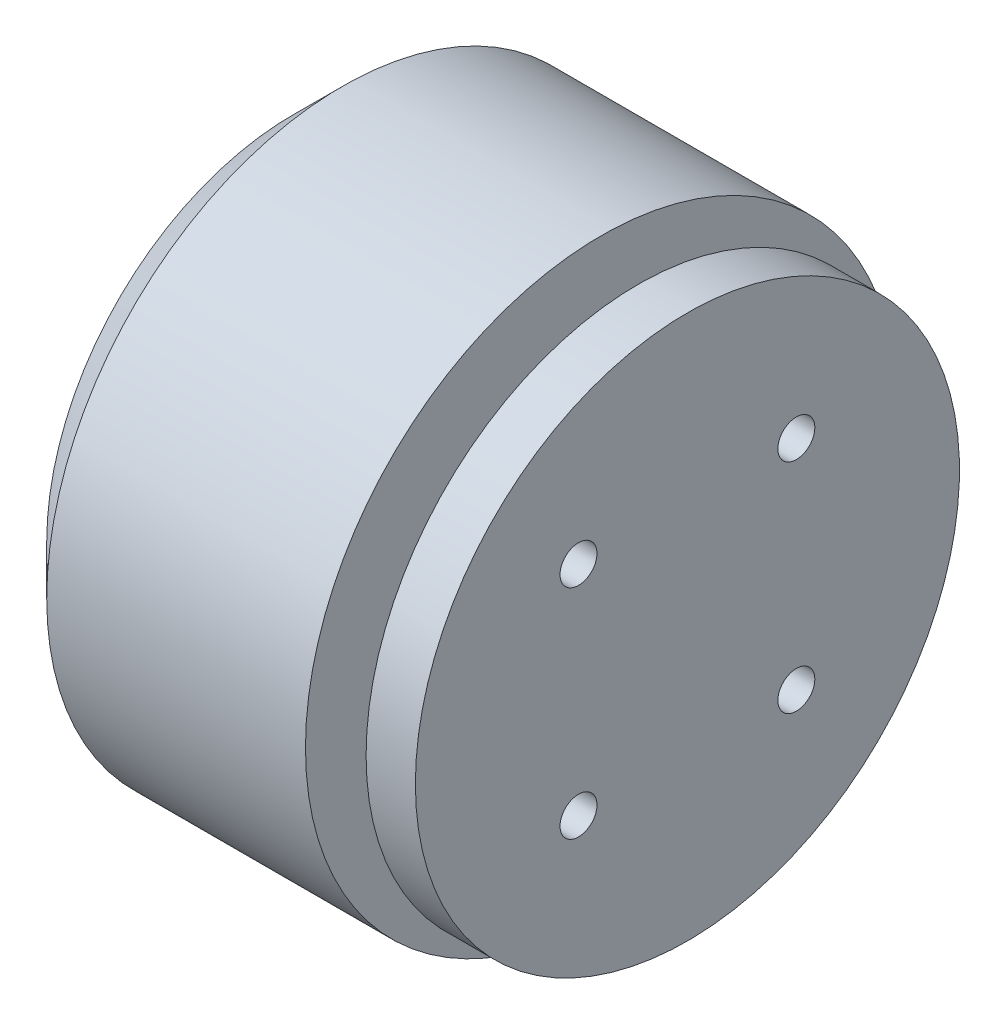
ISO-10303-21;
HEADER;
FILE_DESCRIPTION(('STEP AP214'),'2;1');
FILE_NAME('part.step','',(''),(''),'','','');
FILE_SCHEMA(('AUTOMOTIVE_DESIGN { 1 0 10303 214 1 1 1 1 }'));
ENDSEC;
DATA;
#1=APPLICATION_CONTEXT('core data for automotive mechanical design processes');
#2=APPLICATION_PROTOCOL_DEFINITION('international standard','automotive_design',2000,#1);
#3=PRODUCT_CONTEXT('',#1,'mechanical');
#4=PRODUCT('Part','Part','',(#3));
#5=PRODUCT_RELATED_PRODUCT_CATEGORY('part','',(#4));
#6=PRODUCT_DEFINITION_FORMATION('','',#4);
#7=PRODUCT_DEFINITION_CONTEXT('part definition',#1,'design');
#8=PRODUCT_DEFINITION('design','',#6,#7);
#9=PRODUCT_DEFINITION_SHAPE('','',#8);
#10=(LENGTH_UNIT() NAMED_UNIT(*) SI_UNIT(.MILLI.,.METRE.));
#11=(NAMED_UNIT(*) PLANE_ANGLE_UNIT() SI_UNIT($,.RADIAN.));
#12=(NAMED_UNIT(*) SI_UNIT($,.STERADIAN.) SOLID_ANGLE_UNIT());
#13=UNCERTAINTY_MEASURE_WITH_UNIT(LENGTH_MEASURE(1.E-05),#10,'distance_accuracy_value','');
#14=(GEOMETRIC_REPRESENTATION_CONTEXT(3) GLOBAL_UNCERTAINTY_ASSIGNED_CONTEXT((#13)) GLOBAL_UNIT_ASSIGNED_CONTEXT((#10,
#11,#12)) REPRESENTATION_CONTEXT('',''));
#15=CARTESIAN_POINT('',(0.,0.,0.));
#16=DIRECTION('',(0.,0.,1.));
#17=DIRECTION('',(1.,0.,0.));
#18=AXIS2_PLACEMENT_3D('',#15,#16,#17);
#19=CARTESIAN_POINT('',(0.,0.,0.));
#20=DIRECTION('',(-1.,0.,0.));
#21=DIRECTION('',(0.,0.,1.));
#22=AXIS2_PLACEMENT_3D('',#19,#20,#21);
#23=PLANE('',#22);
#24=CARTESIAN_POINT('',(0.,-8.84,8.84));
#25=DIRECTION('',(1.,0.,0.));
#26=DIRECTION('',(0.,0.,-1.));
#27=AXIS2_PLACEMENT_3D('',#24,#25,#26);
#28=CIRCLE('',#27,1.5);
#29=CARTESIAN_POINT('',(0.,-8.84,7.34));
#30=VERTEX_POINT('',#29);
#31=EDGE_CURVE('E75',#30,#30,#28,.T.);
#32=ORIENTED_EDGE('',*,*,#31,.F.);
#33=EDGE_LOOP('',(#32));
#34=FACE_BOUND('',#33,.T.);
#35=CARTESIAN_POINT('',(0.,8.84,-8.84));
#36=DIRECTION('',(1.,0.,0.));
#37=DIRECTION('',(0.,0.,-1.));
#38=AXIS2_PLACEMENT_3D('',#35,#36,#37);
#39=CIRCLE('',#38,1.5);
#40=CARTESIAN_POINT('',(0.,8.84,-10.34));
#41=VERTEX_POINT('',#40);
#42=EDGE_CURVE('E81',#41,#41,#39,.T.);
#43=ORIENTED_EDGE('',*,*,#42,.F.);
#44=EDGE_LOOP('',(#43));
#45=FACE_BOUND('',#44,.T.);
#46=CARTESIAN_POINT('',(0.,-8.84,-8.84));
#47=DIRECTION('',(1.,0.,0.));
#48=DIRECTION('',(0.,0.,-1.));
#49=AXIS2_PLACEMENT_3D('',#46,#47,#48);
#50=CIRCLE('',#49,1.5);
#51=CARTESIAN_POINT('',(0.,-8.84,-10.34));
#52=VERTEX_POINT('',#51);
#53=EDGE_CURVE('E82',#52,#52,#50,.T.);
#54=ORIENTED_EDGE('',*,*,#53,.F.);
#55=EDGE_LOOP('',(#54));
#56=FACE_BOUND('',#55,.T.);
#57=CARTESIAN_POINT('',(0.,8.84,8.84));
#58=DIRECTION('',(1.,0.,0.));
#59=DIRECTION('',(0.,0.,-1.));
#60=AXIS2_PLACEMENT_3D('',#57,#58,#59);
#61=CIRCLE('',#60,1.5);
#62=CARTESIAN_POINT('',(0.,8.84,7.34));
#63=VERTEX_POINT('',#62);
#64=EDGE_CURVE('E72',#63,#63,#61,.T.);
#65=ORIENTED_EDGE('',*,*,#64,.F.);
#66=EDGE_LOOP('',(#65));
#67=FACE_BOUND('',#66,.T.);
#68=CARTESIAN_POINT('',(0.,0.,0.));
#69=DIRECTION('',(-1.,0.,0.));
#70=DIRECTION('',(0.,0.,1.));
#71=AXIS2_PLACEMENT_3D('',#68,#69,#70);
#72=CIRCLE('',#71,22.08);
#73=CARTESIAN_POINT('',(0.,0.,22.08));
#74=VERTEX_POINT('',#73);
#75=EDGE_CURVE('E10',#74,#74,#72,.T.);
#76=ORIENTED_EDGE('',*,*,#75,.F.);
#77=EDGE_LOOP('',(#76));
#78=FACE_BOUND('',#77,.T.);
#79=ADVANCED_FACE('F37',(#34,#45,#56,#67,#78),#23,.F.);
#80=CARTESIAN_POINT('',(-10.,0.,0.));
#81=DIRECTION('',(-1.,0.,0.));
#82=DIRECTION('',(0.,0.,1.));
#83=AXIS2_PLACEMENT_3D('',#80,#81,#82);
#84=CYLINDRICAL_SURFACE('',#83,22.08);
#85=CARTESIAN_POINT('',(-4.,0.,0.));
#86=DIRECTION('',(-1.,0.,0.));
#87=DIRECTION('',(0.,0.,1.));
#88=AXIS2_PLACEMENT_3D('',#85,#86,#87);
#89=CIRCLE('',#88,22.08);
#90=CARTESIAN_POINT('',(-4.,0.,22.08));
#91=VERTEX_POINT('',#90);
#92=EDGE_CURVE('E43',#91,#91,#89,.T.);
#93=ORIENTED_EDGE('',*,*,#92,.F.);
#94=EDGE_LOOP('',(#93));
#95=FACE_BOUND('',#94,.T.);
#96=ORIENTED_EDGE('',*,*,#75,.T.);
#97=EDGE_LOOP('',(#96));
#98=FACE_BOUND('',#97,.T.);
#99=ADVANCED_FACE('F132',(#95,#98),#84,.T.);
#100=CARTESIAN_POINT('',(-4.,22.08,0.));
#101=DIRECTION('',(1.,0.,0.));
#102=DIRECTION('',(0.,0.,-1.));
#103=AXIS2_PLACEMENT_3D('',#100,#101,#102);
#104=PLANE('',#103);
#105=CARTESIAN_POINT('',(-4.,0.,0.));
#106=DIRECTION('',(-1.,0.,0.));
#107=DIRECTION('',(0.,0.,1.));
#108=AXIS2_PLACEMENT_3D('',#105,#106,#107);
#109=CIRCLE('',#108,16.8);
#110=CARTESIAN_POINT('',(-4.,0.,16.8));
#111=VERTEX_POINT('',#110);
#112=EDGE_CURVE('E47',#111,#111,#109,.T.);
#113=ORIENTED_EDGE('',*,*,#112,.F.);
#114=EDGE_LOOP('',(#113));
#115=FACE_BOUND('',#114,.T.);
#116=ORIENTED_EDGE('',*,*,#92,.T.);
#117=EDGE_LOOP('',(#116));
#118=FACE_BOUND('',#117,.T.);
#119=ADVANCED_FACE('F139',(#115,#118),#104,.F.);
#120=CARTESIAN_POINT('',(-10.,0.,0.));
#121=DIRECTION('',(-1.,0.,0.));
#122=DIRECTION('',(0.,0.,1.));
#123=AXIS2_PLACEMENT_3D('',#120,#121,#122);
#124=CYLINDRICAL_SURFACE('',#123,16.8);
#125=CARTESIAN_POINT('',(-7.,0.,0.));
#126=DIRECTION('',(-1.,0.,0.));
#127=DIRECTION('',(0.,0.,1.));
#128=AXIS2_PLACEMENT_3D('',#125,#126,#127);
#129=CIRCLE('',#128,16.8);
#130=CARTESIAN_POINT('',(-7.,0.,16.8));
#131=VERTEX_POINT('',#130);
#132=EDGE_CURVE('E51',#131,#131,#129,.T.);
#133=ORIENTED_EDGE('',*,*,#132,.F.);
#134=EDGE_LOOP('',(#133));
#135=FACE_BOUND('',#134,.T.);
#136=ORIENTED_EDGE('',*,*,#112,.T.);
#137=EDGE_LOOP('',(#136));
#138=FACE_BOUND('',#137,.T.);
#139=ADVANCED_FACE('F185',(#135,#138),#124,.T.);
#140=CARTESIAN_POINT('',(-7.,16.8,0.));
#141=DIRECTION('',(-1.,0.,0.));
#142=DIRECTION('',(0.,0.,1.));
#143=AXIS2_PLACEMENT_3D('',#140,#141,#142);
#144=PLANE('',#143);
#145=CARTESIAN_POINT('',(-7.,0.,0.));
#146=DIRECTION('',(-1.,0.,0.));
#147=DIRECTION('',(0.,0.,1.));
#148=AXIS2_PLACEMENT_3D('',#145,#146,#147);
#149=CIRCLE('',#148,24.);
#150=CARTESIAN_POINT('',(-7.,0.,24.));
#151=VERTEX_POINT('',#150);
#152=EDGE_CURVE('E56',#151,#151,#149,.T.);
#153=ORIENTED_EDGE('',*,*,#152,.F.);
#154=EDGE_LOOP('',(#153));
#155=FACE_BOUND('',#154,.T.);
#156=ORIENTED_EDGE('',*,*,#132,.T.);
#157=EDGE_LOOP('',(#156));
#158=FACE_BOUND('',#157,.T.);
#159=ADVANCED_FACE('F181',(#155,#158),#144,.F.);
#160=CARTESIAN_POINT('',(-10.,0.,0.));
#161=DIRECTION('',(-1.,0.,0.));
#162=DIRECTION('',(0.,0.,1.));
#163=AXIS2_PLACEMENT_3D('',#160,#161,#162);
#164=CYLINDRICAL_SURFACE('',#163,24.);
#165=CARTESIAN_POINT('',(-28.,0.,0.));
#166=DIRECTION('',(-1.,0.,0.));
#167=DIRECTION('',(0.,0.,1.));
#168=AXIS2_PLACEMENT_3D('',#165,#166,#167);
#169=CIRCLE('',#168,24.);
#170=CARTESIAN_POINT('',(-28.,0.,24.));
#171=VERTEX_POINT('',#170);
#172=EDGE_CURVE('E59',#171,#171,#169,.T.);
#173=ORIENTED_EDGE('',*,*,#172,.F.);
#174=EDGE_LOOP('',(#173));
#175=FACE_BOUND('',#174,.T.);
#176=ORIENTED_EDGE('',*,*,#152,.T.);
#177=EDGE_LOOP('',(#176));
#178=FACE_BOUND('',#177,.T.);
#179=ADVANCED_FACE('F177',(#175,#178),#164,.T.);
#180=CARTESIAN_POINT('',(-28.,0.,0.));
#181=DIRECTION('',(1.,0.,0.));
#182=DIRECTION('',(0.,0.,-1.));
#183=AXIS2_PLACEMENT_3D('',#180,#181,#182);
#184=CONICAL_SURFACE('',#183,24.,0.785398163397449);
#185=CARTESIAN_POINT('',(-32.,0.,0.));
#186=DIRECTION('',(-1.,0.,0.));
#187=DIRECTION('',(0.,0.,1.));
#188=AXIS2_PLACEMENT_3D('',#185,#186,#187);
#189=CIRCLE('',#188,20.);
#190=CARTESIAN_POINT('',(-32.,0.,20.));
#191=VERTEX_POINT('',#190);
#192=EDGE_CURVE('E62',#191,#191,#189,.T.);
#193=ORIENTED_EDGE('',*,*,#192,.F.);
#194=EDGE_LOOP('',(#193));
#195=FACE_BOUND('',#194,.T.);
#196=ORIENTED_EDGE('',*,*,#172,.T.);
#197=EDGE_LOOP('',(#196));
#198=FACE_BOUND('',#197,.T.);
#199=ADVANCED_FACE('F173',(#195,#198),#184,.T.);
#200=CARTESIAN_POINT('',(-32.,20.,0.));
#201=DIRECTION('',(1.,0.,0.));
#202=DIRECTION('',(0.,0.,-1.));
#203=AXIS2_PLACEMENT_3D('',#200,#201,#202);
#204=PLANE('',#203);
#205=CARTESIAN_POINT('',(-32.,0.,6.));
#206=DIRECTION('',(1.,0.,0.));
#207=DIRECTION('',(0.,0.,-1.));
#208=AXIS2_PLACEMENT_3D('',#205,#206,#207);
#209=CIRCLE('',#208,1.5);
#210=CARTESIAN_POINT('',(-32.,0.,4.5));
#211=VERTEX_POINT('',#210);
#212=EDGE_CURVE('E114',#211,#211,#209,.T.);
#213=ORIENTED_EDGE('',*,*,#212,.T.);
#214=EDGE_LOOP('',(#213));
#215=FACE_BOUND('',#214,.T.);
#216=CARTESIAN_POINT('',(-32.,0.,-6.));
#217=DIRECTION('',(1.,0.,0.));
#218=DIRECTION('',(0.,0.,-1.));
#219=AXIS2_PLACEMENT_3D('',#216,#217,#218);
#220=CIRCLE('',#219,1.5);
#221=CARTESIAN_POINT('',(-32.,0.,-7.5));
#222=VERTEX_POINT('',#221);
#223=EDGE_CURVE('E111',#222,#222,#220,.T.);
#224=ORIENTED_EDGE('',*,*,#223,.T.);
#225=EDGE_LOOP('',(#224));
#226=FACE_BOUND('',#225,.T.);
#227=CARTESIAN_POINT('',(-32.,6.,0.));
#228=DIRECTION('',(1.,0.,0.));
#229=DIRECTION('',(0.,0.,-1.));
#230=AXIS2_PLACEMENT_3D('',#227,#228,#229);
#231=CIRCLE('',#230,1.5);
#232=CARTESIAN_POINT('',(-32.,6.,-1.5));
#233=VERTEX_POINT('',#232);
#234=EDGE_CURVE('E105',#233,#233,#231,.T.);
#235=ORIENTED_EDGE('',*,*,#234,.T.);
#236=EDGE_LOOP('',(#235));
#237=FACE_BOUND('',#236,.T.);
#238=CARTESIAN_POINT('',(-32.,-6.,0.));
#239=DIRECTION('',(1.,0.,0.));
#240=DIRECTION('',(0.,0.,-1.));
#241=AXIS2_PLACEMENT_3D('',#238,#239,#240);
#242=CIRCLE('',#241,1.5);
#243=CARTESIAN_POINT('',(-32.,-6.,-1.5));
#244=VERTEX_POINT('',#243);
#245=EDGE_CURVE('E99',#244,#244,#242,.T.);
#246=ORIENTED_EDGE('',*,*,#245,.T.);
#247=EDGE_LOOP('',(#246));
#248=FACE_BOUND('',#247,.T.);
#249=CARTESIAN_POINT('',(-32.,0.,0.));
#250=DIRECTION('',(-1.,0.,0.));
#251=DIRECTION('',(0.,0.,1.));
#252=AXIS2_PLACEMENT_3D('',#249,#250,#251);
#253=CIRCLE('',#252,2.);
#254=CARTESIAN_POINT('',(-32.,0.,2.));
#255=VERTEX_POINT('',#254);
#256=EDGE_CURVE('E65',#255,#255,#253,.T.);
#257=ORIENTED_EDGE('',*,*,#256,.F.);
#258=EDGE_LOOP('',(#257));
#259=FACE_BOUND('',#258,.T.);
#260=ORIENTED_EDGE('',*,*,#192,.T.);
#261=EDGE_LOOP('',(#260));
#262=FACE_BOUND('',#261,.T.);
#263=ADVANCED_FACE('F169',(#215,#226,#237,#248,#259,#262),#204,.F.);
#264=CARTESIAN_POINT('',(-10.,0.,0.));
#265=DIRECTION('',(-1.,0.,0.));
#266=DIRECTION('',(0.,0.,1.));
#267=AXIS2_PLACEMENT_3D('',#264,#265,#266);
#268=CYLINDRICAL_SURFACE('',#267,2.);
#269=CARTESIAN_POINT('',(-44.,0.,0.));
#270=DIRECTION('',(-1.,0.,0.));
#271=DIRECTION('',(0.,0.,1.));
#272=AXIS2_PLACEMENT_3D('',#269,#270,#271);
#273=CIRCLE('',#272,2.);
#274=CARTESIAN_POINT('',(-44.,0.,2.));
#275=VERTEX_POINT('',#274);
#276=EDGE_CURVE('E68',#275,#275,#273,.T.);
#277=ORIENTED_EDGE('',*,*,#276,.F.);
#278=EDGE_LOOP('',(#277));
#279=FACE_BOUND('',#278,.T.);
#280=ORIENTED_EDGE('',*,*,#256,.T.);
#281=EDGE_LOOP('',(#280));
#282=FACE_BOUND('',#281,.T.);
#283=ADVANCED_FACE('F161',(#279,#282),#268,.T.);
#284=CARTESIAN_POINT('',(-44.,2.,0.));
#285=DIRECTION('',(1.,0.,0.));
#286=DIRECTION('',(0.,0.,-1.));
#287=AXIS2_PLACEMENT_3D('',#284,#285,#286);
#288=PLANE('',#287);
#289=ORIENTED_EDGE('',*,*,#276,.T.);
#290=EDGE_LOOP('',(#289));
#291=FACE_BOUND('',#290,.T.);
#292=ADVANCED_FACE('F152',(#291),#288,.F.);
#293=CARTESIAN_POINT('',(-3.3,8.84,8.84));
#294=DIRECTION('',(1.,0.,0.));
#295=DIRECTION('',(0.,0.,-1.));
#296=AXIS2_PLACEMENT_3D('',#293,#294,#295);
#297=CYLINDRICAL_SURFACE('',#296,1.5);
#298=CARTESIAN_POINT('',(-3.3,8.84,8.84));
#299=DIRECTION('',(1.,0.,0.));
#300=DIRECTION('',(0.,0.,-1.));
#301=AXIS2_PLACEMENT_3D('',#298,#299,#300);
#302=CIRCLE('',#301,1.5);
#303=CARTESIAN_POINT('',(-3.3,8.84,7.34));
#304=VERTEX_POINT('',#303);
#305=EDGE_CURVE('E71',#304,#304,#302,.T.);
#306=ORIENTED_EDGE('',*,*,#305,.F.);
#307=EDGE_LOOP('',(#306));
#308=FACE_BOUND('',#307,.T.);
#309=ORIENTED_EDGE('',*,*,#64,.T.);
#310=EDGE_LOOP('',(#309));
#311=FACE_BOUND('',#310,.T.);
#312=ADVANCED_FACE('F150',(#308,#311),#297,.F.);
#313=CARTESIAN_POINT('',(-3.3,8.84,8.84));
#314=DIRECTION('',(1.,0.,0.));
#315=DIRECTION('',(0.,0.,-1.));
#316=AXIS2_PLACEMENT_3D('',#313,#314,#315);
#317=PLANE('',#316);
#318=ORIENTED_EDGE('',*,*,#305,.T.);
#319=EDGE_LOOP('',(#318));
#320=FACE_BOUND('',#319,.T.);
#321=ADVANCED_FACE('F151',(#320),#317,.T.);
#322=CARTESIAN_POINT('',(-3.3,-8.84,-8.84));
#323=DIRECTION('',(1.,0.,0.));
#324=DIRECTION('',(0.,0.,-1.));
#325=AXIS2_PLACEMENT_3D('',#322,#323,#324);
#326=CYLINDRICAL_SURFACE('',#325,1.5);
#327=CARTESIAN_POINT('',(-3.3,-8.84,-8.84));
#328=DIRECTION('',(1.,0.,0.));
#329=DIRECTION('',(0.,0.,-1.));
#330=AXIS2_PLACEMENT_3D('',#327,#328,#329);
#331=CIRCLE('',#330,1.5);
#332=CARTESIAN_POINT('',(-3.3,-8.84,-10.34));
#333=VERTEX_POINT('',#332);
#334=EDGE_CURVE('E90',#333,#333,#331,.T.);
#335=ORIENTED_EDGE('',*,*,#334,.F.);
#336=EDGE_LOOP('',(#335));
#337=FACE_BOUND('',#336,.T.);
#338=ORIENTED_EDGE('',*,*,#53,.T.);
#339=EDGE_LOOP('',(#338));
#340=FACE_BOUND('',#339,.T.);
#341=ADVANCED_FACE('F158',(#337,#340),#326,.F.);
#342=CARTESIAN_POINT('',(-3.3,-8.84,-8.84));
#343=DIRECTION('',(1.,0.,0.));
#344=DIRECTION('',(0.,0.,-1.));
#345=AXIS2_PLACEMENT_3D('',#342,#343,#344);
#346=PLANE('',#345);
#347=ORIENTED_EDGE('',*,*,#334,.T.);
#348=EDGE_LOOP('',(#347));
#349=FACE_BOUND('',#348,.T.);
#350=ADVANCED_FACE('F249',(#349),#346,.T.);
#351=CARTESIAN_POINT('',(-3.3,8.84,-8.84));
#352=DIRECTION('',(1.,0.,0.));
#353=DIRECTION('',(0.,0.,-1.));
#354=AXIS2_PLACEMENT_3D('',#351,#352,#353);
#355=CYLINDRICAL_SURFACE('',#354,1.5);
#356=CARTESIAN_POINT('',(-3.3,8.84,-8.84));
#357=DIRECTION('',(1.,0.,0.));
#358=DIRECTION('',(0.,0.,-1.));
#359=AXIS2_PLACEMENT_3D('',#356,#357,#358);
#360=CIRCLE('',#359,1.5);
#361=CARTESIAN_POINT('',(-3.3,8.84,-10.34));
#362=VERTEX_POINT('',#361);
#363=EDGE_CURVE('E78',#362,#362,#360,.T.);
#364=ORIENTED_EDGE('',*,*,#363,.F.);
#365=EDGE_LOOP('',(#364));
#366=FACE_BOUND('',#365,.T.);
#367=ORIENTED_EDGE('',*,*,#42,.T.);
#368=EDGE_LOOP('',(#367));
#369=FACE_BOUND('',#368,.T.);
#370=ADVANCED_FACE('F259',(#366,#369),#355,.F.);
#371=CARTESIAN_POINT('',(-3.3,8.84,-8.84));
#372=DIRECTION('',(1.,0.,0.));
#373=DIRECTION('',(0.,0.,-1.));
#374=AXIS2_PLACEMENT_3D('',#371,#372,#373);
#375=PLANE('',#374);
#376=ORIENTED_EDGE('',*,*,#363,.T.);
#377=EDGE_LOOP('',(#376));
#378=FACE_BOUND('',#377,.T.);
#379=ADVANCED_FACE('F269',(#378),#375,.T.);
#380=CARTESIAN_POINT('',(-3.3,-8.84,8.84));
#381=DIRECTION('',(1.,0.,0.));
#382=DIRECTION('',(0.,0.,-1.));
#383=AXIS2_PLACEMENT_3D('',#380,#381,#382);
#384=CYLINDRICAL_SURFACE('',#383,1.5);
#385=CARTESIAN_POINT('',(-3.3,-8.84,8.84));
#386=DIRECTION('',(1.,0.,0.));
#387=DIRECTION('',(0.,0.,-1.));
#388=AXIS2_PLACEMENT_3D('',#385,#386,#387);
#389=CIRCLE('',#388,1.5);
#390=CARTESIAN_POINT('',(-3.3,-8.84,7.34));
#391=VERTEX_POINT('',#390);
#392=EDGE_CURVE('E85',#391,#391,#389,.T.);
#393=ORIENTED_EDGE('',*,*,#392,.F.);
#394=EDGE_LOOP('',(#393));
#395=FACE_BOUND('',#394,.T.);
#396=ORIENTED_EDGE('',*,*,#31,.T.);
#397=EDGE_LOOP('',(#396));
#398=FACE_BOUND('',#397,.T.);
#399=ADVANCED_FACE('F279',(#395,#398),#384,.F.);
#400=CARTESIAN_POINT('',(-3.3,-8.84,8.84));
#401=DIRECTION('',(1.,0.,0.));
#402=DIRECTION('',(0.,0.,-1.));
#403=AXIS2_PLACEMENT_3D('',#400,#401,#402);
#404=PLANE('',#403);
#405=ORIENTED_EDGE('',*,*,#392,.T.);
#406=EDGE_LOOP('',(#405));
#407=FACE_BOUND('',#406,.T.);
#408=ADVANCED_FACE('F288',(#407),#404,.T.);
#409=CARTESIAN_POINT('',(-24.,-6.,0.));
#410=DIRECTION('',(-1.,0.,0.));
#411=DIRECTION('',(0.,0.,1.));
#412=AXIS2_PLACEMENT_3D('',#409,#410,#411);
#413=CYLINDRICAL_SURFACE('',#412,1.5);
#414=CARTESIAN_POINT('',(-24.,-6.,0.));
#415=DIRECTION('',(1.,0.,0.));
#416=DIRECTION('',(0.,0.,-1.));
#417=AXIS2_PLACEMENT_3D('',#414,#415,#416);
#418=CIRCLE('',#417,1.5);
#419=CARTESIAN_POINT('',(-24.,-6.,-1.5));
#420=VERTEX_POINT('',#419);
#421=EDGE_CURVE('E96',#420,#420,#418,.T.);
#422=ORIENTED_EDGE('',*,*,#421,.T.);
#423=EDGE_LOOP('',(#422));
#424=FACE_BOUND('',#423,.T.);
#425=ORIENTED_EDGE('',*,*,#245,.F.);
#426=EDGE_LOOP('',(#425));
#427=FACE_BOUND('',#426,.T.);
#428=ADVANCED_FACE('F298',(#424,#427),#413,.F.);
#429=CARTESIAN_POINT('',(-24.,-6.,0.));
#430=DIRECTION('',(1.,0.,0.));
#431=DIRECTION('',(0.,0.,-1.));
#432=AXIS2_PLACEMENT_3D('',#429,#430,#431);
#433=PLANE('',#432);
#434=ORIENTED_EDGE('',*,*,#421,.F.);
#435=EDGE_LOOP('',(#434));
#436=FACE_BOUND('',#435,.T.);
#437=ADVANCED_FACE('F308',(#436),#433,.F.);
#438=CARTESIAN_POINT('',(-24.,6.,0.));
#439=DIRECTION('',(-1.,0.,0.));
#440=DIRECTION('',(0.,0.,1.));
#441=AXIS2_PLACEMENT_3D('',#438,#439,#440);
#442=CYLINDRICAL_SURFACE('',#441,1.5);
#443=CARTESIAN_POINT('',(-24.,6.,0.));
#444=DIRECTION('',(1.,0.,0.));
#445=DIRECTION('',(0.,0.,-1.));
#446=AXIS2_PLACEMENT_3D('',#443,#444,#445);
#447=CIRCLE('',#446,1.5);
#448=CARTESIAN_POINT('',(-24.,6.,-1.5));
#449=VERTEX_POINT('',#448);
#450=EDGE_CURVE('E102',#449,#449,#447,.T.);
#451=ORIENTED_EDGE('',*,*,#450,.T.);
#452=EDGE_LOOP('',(#451));
#453=FACE_BOUND('',#452,.T.);
#454=ORIENTED_EDGE('',*,*,#234,.F.);
#455=EDGE_LOOP('',(#454));
#456=FACE_BOUND('',#455,.T.);
#457=ADVANCED_FACE('F318',(#453,#456),#442,.F.);
#458=CARTESIAN_POINT('',(-24.,6.,0.));
#459=DIRECTION('',(1.,0.,0.));
#460=DIRECTION('',(0.,0.,-1.));
#461=AXIS2_PLACEMENT_3D('',#458,#459,#460);
#462=PLANE('',#461);
#463=ORIENTED_EDGE('',*,*,#450,.F.);
#464=EDGE_LOOP('',(#463));
#465=FACE_BOUND('',#464,.T.);
#466=ADVANCED_FACE('F328',(#465),#462,.F.);
#467=CARTESIAN_POINT('',(-24.,0.,-6.));
#468=DIRECTION('',(-1.,0.,0.));
#469=DIRECTION('',(0.,0.,1.));
#470=AXIS2_PLACEMENT_3D('',#467,#468,#469);
#471=CYLINDRICAL_SURFACE('',#470,1.5);
#472=CARTESIAN_POINT('',(-24.,0.,-6.));
#473=DIRECTION('',(1.,0.,0.));
#474=DIRECTION('',(0.,0.,-1.));
#475=AXIS2_PLACEMENT_3D('',#472,#473,#474);
#476=CIRCLE('',#475,1.5);
#477=CARTESIAN_POINT('',(-24.,0.,-7.5));
#478=VERTEX_POINT('',#477);
#479=EDGE_CURVE('E108',#478,#478,#476,.T.);
#480=ORIENTED_EDGE('',*,*,#479,.T.);
#481=EDGE_LOOP('',(#480));
#482=FACE_BOUND('',#481,.T.);
#483=ORIENTED_EDGE('',*,*,#223,.F.);
#484=EDGE_LOOP('',(#483));
#485=FACE_BOUND('',#484,.T.);
#486=ADVANCED_FACE('F338',(#482,#485),#471,.F.);
#487=CARTESIAN_POINT('',(-24.,0.,-6.));
#488=DIRECTION('',(1.,0.,0.));
#489=DIRECTION('',(0.,0.,-1.));
#490=AXIS2_PLACEMENT_3D('',#487,#488,#489);
#491=PLANE('',#490);
#492=ORIENTED_EDGE('',*,*,#479,.F.);
#493=EDGE_LOOP('',(#492));
#494=FACE_BOUND('',#493,.T.);
#495=ADVANCED_FACE('F129',(#494),#491,.F.);
#496=CARTESIAN_POINT('',(-24.,0.,6.));
#497=DIRECTION('',(-1.,0.,0.));
#498=DIRECTION('',(0.,0.,1.));
#499=AXIS2_PLACEMENT_3D('',#496,#497,#498);
#500=CYLINDRICAL_SURFACE('',#499,1.5);
#501=CARTESIAN_POINT('',(-24.,0.,6.));
#502=DIRECTION('',(1.,0.,0.));
#503=DIRECTION('',(0.,0.,-1.));
#504=AXIS2_PLACEMENT_3D('',#501,#502,#503);
#505=CIRCLE('',#504,1.5);
#506=CARTESIAN_POINT('',(-24.,0.,4.5));
#507=VERTEX_POINT('',#506);
#508=EDGE_CURVE('E93',#507,#507,#505,.T.);
#509=ORIENTED_EDGE('',*,*,#508,.T.);
#510=EDGE_LOOP('',(#509));
#511=FACE_BOUND('',#510,.T.);
#512=ORIENTED_EDGE('',*,*,#212,.F.);
#513=EDGE_LOOP('',(#512));
#514=FACE_BOUND('',#513,.T.);
#515=ADVANCED_FACE('F120',(#511,#514),#500,.F.);
#516=CARTESIAN_POINT('',(-24.,0.,6.));
#517=DIRECTION('',(1.,0.,0.));
#518=DIRECTION('',(0.,0.,-1.));
#519=AXIS2_PLACEMENT_3D('',#516,#517,#518);
#520=PLANE('',#519);
#521=ORIENTED_EDGE('',*,*,#508,.F.);
#522=EDGE_LOOP('',(#521));
#523=FACE_BOUND('',#522,.T.);
#524=ADVANCED_FACE('F123',(#523),#520,.F.);
#525=CLOSED_SHELL('',(#79,#99,#119,#139,#159,#179,#199,#263,#283,#292,#312,#321,#341,#350,#370,
#379,#399,#408,#428,#437,#457,#466,#486,#495,#515,#524));
#526=MANIFOLD_SOLID_BREP('B2',#525);
#527=ADVANCED_BREP_SHAPE_REPRESENTATION('',(#18,#526),#14);
#528=SHAPE_DEFINITION_REPRESENTATION(#9,#527);
ENDSEC;
END-ISO-10303-21;
